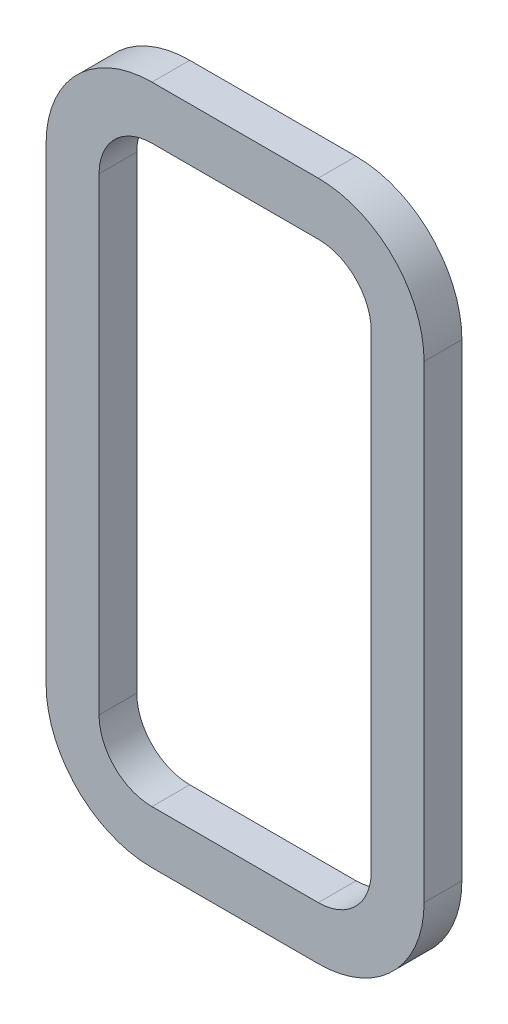
ISO-10303-21;
HEADER;
FILE_DESCRIPTION(('STEP AP214'),'2;1');
FILE_NAME('part.step','',(''),(''),'','','');
FILE_SCHEMA(('AUTOMOTIVE_DESIGN { 1 0 10303 214 1 1 1 1 }'));
ENDSEC;
DATA;
#1=APPLICATION_CONTEXT('core data for automotive mechanical design processes');
#2=APPLICATION_PROTOCOL_DEFINITION('international standard','automotive_design',2000,#1);
#3=PRODUCT_CONTEXT('',#1,'mechanical');
#4=PRODUCT('Part','Part','',(#3));
#5=PRODUCT_RELATED_PRODUCT_CATEGORY('part','',(#4));
#6=PRODUCT_DEFINITION_FORMATION('','',#4);
#7=PRODUCT_DEFINITION_CONTEXT('part definition',#1,'design');
#8=PRODUCT_DEFINITION('design','',#6,#7);
#9=PRODUCT_DEFINITION_SHAPE('','',#8);
#10=(LENGTH_UNIT() NAMED_UNIT(*) SI_UNIT(.MILLI.,.METRE.));
#11=(NAMED_UNIT(*) PLANE_ANGLE_UNIT() SI_UNIT($,.RADIAN.));
#12=(NAMED_UNIT(*) SI_UNIT($,.STERADIAN.) SOLID_ANGLE_UNIT());
#13=UNCERTAINTY_MEASURE_WITH_UNIT(LENGTH_MEASURE(1.E-05),#10,'distance_accuracy_value','');
#14=(GEOMETRIC_REPRESENTATION_CONTEXT(3) GLOBAL_UNCERTAINTY_ASSIGNED_CONTEXT((#13)) GLOBAL_UNIT_ASSIGNED_CONTEXT((#10,
#11,#12)) REPRESENTATION_CONTEXT('',''));
#15=CARTESIAN_POINT('',(0.,0.,0.));
#16=DIRECTION('',(0.,0.,1.));
#17=DIRECTION('',(1.,0.,0.));
#18=AXIS2_PLACEMENT_3D('',#15,#16,#17);
#19=CARTESIAN_POINT('',(-50.,-90.,10.));
#20=DIRECTION('',(0.,0.,1.));
#21=DIRECTION('',(1.,0.,0.));
#22=AXIS2_PLACEMENT_3D('',#19,#20,#21);
#23=PLANE('',#22);
#24=DIRECTION('',(0.,-1.,0.));
#25=VECTOR('',#24,1.);
#26=CARTESIAN_POINT('',(-50.,90.,10.));
#27=LINE('',#26,#25);
#28=CARTESIAN_POINT('',(-50.,62.,10.));
#29=VERTEX_POINT('',#28);
#30=CARTESIAN_POINT('',(-50.,-61.9999999999999,10.));
#31=VERTEX_POINT('',#30);
#32=EDGE_CURVE('E247',#29,#31,#27,.T.);
#33=ORIENTED_EDGE('',*,*,#32,.T.);
#34=CARTESIAN_POINT('',(-22.,-62.,10.));
#35=DIRECTION('',(0.,0.,1.));
#36=DIRECTION('',(1.,0.,0.));
#37=AXIS2_PLACEMENT_3D('',#34,#35,#36);
#38=CIRCLE('',#37,28.);
#39=CARTESIAN_POINT('',(-22.,-90.,10.));
#40=VERTEX_POINT('',#39);
#41=EDGE_CURVE('E231',#31,#40,#38,.T.);
#42=ORIENTED_EDGE('',*,*,#41,.T.);
#43=DIRECTION('',(1.,0.,0.));
#44=VECTOR('',#43,1.);
#45=CARTESIAN_POINT('',(-50.,-90.,10.));
#46=LINE('',#45,#44);
#47=CARTESIAN_POINT('',(22.,-90.,10.));
#48=VERTEX_POINT('',#47);
#49=EDGE_CURVE('E250',#40,#48,#46,.T.);
#50=ORIENTED_EDGE('',*,*,#49,.T.);
#51=CARTESIAN_POINT('',(22.,-62.,10.));
#52=DIRECTION('',(0.,0.,1.));
#53=DIRECTION('',(1.,0.,0.));
#54=AXIS2_PLACEMENT_3D('',#51,#52,#53);
#55=CIRCLE('',#54,28.);
#56=CARTESIAN_POINT('',(50.,-61.9999999999999,10.));
#57=VERTEX_POINT('',#56);
#58=EDGE_CURVE('E229',#48,#57,#55,.T.);
#59=ORIENTED_EDGE('',*,*,#58,.T.);
#60=DIRECTION('',(0.,1.,0.));
#61=VECTOR('',#60,1.);
#62=CARTESIAN_POINT('',(50.,90.,10.));
#63=LINE('',#62,#61);
#64=CARTESIAN_POINT('',(50.,62.,10.));
#65=VERTEX_POINT('',#64);
#66=EDGE_CURVE('E177',#57,#65,#63,.T.);
#67=ORIENTED_EDGE('',*,*,#66,.T.);
#68=CARTESIAN_POINT('',(22.,62.,10.));
#69=DIRECTION('',(0.,0.,1.));
#70=DIRECTION('',(1.,0.,0.));
#71=AXIS2_PLACEMENT_3D('',#68,#69,#70);
#72=CIRCLE('',#71,28.);
#73=CARTESIAN_POINT('',(22.,90.,10.));
#74=VERTEX_POINT('',#73);
#75=EDGE_CURVE('E55',#65,#74,#72,.T.);
#76=ORIENTED_EDGE('',*,*,#75,.T.);
#77=DIRECTION('',(-1.,0.,0.));
#78=VECTOR('',#77,1.);
#79=CARTESIAN_POINT('',(-50.,90.,10.));
#80=LINE('',#79,#78);
#81=CARTESIAN_POINT('',(-22.,90.,10.));
#82=VERTEX_POINT('',#81);
#83=EDGE_CURVE('E173',#74,#82,#80,.T.);
#84=ORIENTED_EDGE('',*,*,#83,.T.);
#85=CARTESIAN_POINT('',(-22.,62.,10.));
#86=DIRECTION('',(0.,0.,1.));
#87=DIRECTION('',(1.,0.,0.));
#88=AXIS2_PLACEMENT_3D('',#85,#86,#87);
#89=CIRCLE('',#88,28.);
#90=EDGE_CURVE('E227',#82,#29,#89,.T.);
#91=ORIENTED_EDGE('',*,*,#90,.T.);
#92=EDGE_LOOP('',(#33,#42,#50,#59,#67,#76,#84,#91));
#93=FACE_BOUND('',#92,.T.);
#94=DIRECTION('',(1.,0.,0.));
#95=VECTOR('',#94,1.);
#96=CARTESIAN_POINT('',(-36.,-76.,10.));
#97=LINE('',#96,#95);
#98=CARTESIAN_POINT('',(-22.,-76.,10.));
#99=VERTEX_POINT('',#98);
#100=CARTESIAN_POINT('',(22.,-76.,10.));
#101=VERTEX_POINT('',#100);
#102=EDGE_CURVE('E277',#99,#101,#97,.T.);
#103=ORIENTED_EDGE('',*,*,#102,.F.);
#104=CARTESIAN_POINT('',(-22.,-62.,10.));
#105=DIRECTION('',(0.,0.,1.));
#106=DIRECTION('',(1.,0.,0.));
#107=AXIS2_PLACEMENT_3D('',#104,#105,#106);
#108=CIRCLE('',#107,14.);
#109=CARTESIAN_POINT('',(-36.,-62.,10.));
#110=VERTEX_POINT('',#109);
#111=EDGE_CURVE('E159',#99,#110,#108,.F.);
#112=ORIENTED_EDGE('',*,*,#111,.T.);
#113=DIRECTION('',(0.,-1.,0.));
#114=VECTOR('',#113,1.);
#115=CARTESIAN_POINT('',(-36.,76.,10.));
#116=LINE('',#115,#114);
#117=CARTESIAN_POINT('',(-36.,62.,10.));
#118=VERTEX_POINT('',#117);
#119=EDGE_CURVE('E266',#118,#110,#116,.T.);
#120=ORIENTED_EDGE('',*,*,#119,.F.);
#121=CARTESIAN_POINT('',(-22.,62.,10.));
#122=DIRECTION('',(0.,0.,1.));
#123=DIRECTION('',(1.,0.,0.));
#124=AXIS2_PLACEMENT_3D('',#121,#122,#123);
#125=CIRCLE('',#124,14.);
#126=CARTESIAN_POINT('',(-22.,76.,10.));
#127=VERTEX_POINT('',#126);
#128=EDGE_CURVE('E158',#118,#127,#125,.F.);
#129=ORIENTED_EDGE('',*,*,#128,.T.);
#130=DIRECTION('',(-1.,0.,0.));
#131=VECTOR('',#130,1.);
#132=CARTESIAN_POINT('',(-36.,76.,10.));
#133=LINE('',#132,#131);
#134=CARTESIAN_POINT('',(22.,76.,10.));
#135=VERTEX_POINT('',#134);
#136=EDGE_CURVE('E260',#135,#127,#133,.T.);
#137=ORIENTED_EDGE('',*,*,#136,.F.);
#138=CARTESIAN_POINT('',(22.,62.,10.));
#139=DIRECTION('',(0.,0.,1.));
#140=DIRECTION('',(1.,0.,0.));
#141=AXIS2_PLACEMENT_3D('',#138,#139,#140);
#142=CIRCLE('',#141,14.);
#143=CARTESIAN_POINT('',(36.,62.,10.));
#144=VERTEX_POINT('',#143);
#145=EDGE_CURVE('E202',#135,#144,#142,.F.);
#146=ORIENTED_EDGE('',*,*,#145,.T.);
#147=DIRECTION('',(0.,1.,0.));
#148=VECTOR('',#147,1.);
#149=CARTESIAN_POINT('',(36.,76.,10.));
#150=LINE('',#149,#148);
#151=CARTESIAN_POINT('',(36.,-62.,10.));
#152=VERTEX_POINT('',#151);
#153=EDGE_CURVE('E274',#152,#144,#150,.T.);
#154=ORIENTED_EDGE('',*,*,#153,.F.);
#155=CARTESIAN_POINT('',(22.,-62.,10.));
#156=DIRECTION('',(0.,0.,1.));
#157=DIRECTION('',(1.,0.,0.));
#158=AXIS2_PLACEMENT_3D('',#155,#156,#157);
#159=CIRCLE('',#158,14.);
#160=EDGE_CURVE('E206',#152,#101,#159,.F.);
#161=ORIENTED_EDGE('',*,*,#160,.T.);
#162=EDGE_LOOP('',(#103,#112,#120,#129,#137,#146,#154,#161));
#163=FACE_BOUND('',#162,.T.);
#164=ADVANCED_FACE('F35',(#93,#163),#23,.T.);
#165=CARTESIAN_POINT('',(-50.,-90.,0.));
#166=DIRECTION('',(0.,0.,1.));
#167=DIRECTION('',(1.,0.,0.));
#168=AXIS2_PLACEMENT_3D('',#165,#166,#167);
#169=PLANE('',#168);
#170=DIRECTION('',(1.,0.,0.));
#171=VECTOR('',#170,1.);
#172=CARTESIAN_POINT('',(-50.,-90.,0.));
#173=LINE('',#172,#171);
#174=CARTESIAN_POINT('',(-22.,-90.,0.));
#175=VERTEX_POINT('',#174);
#176=CARTESIAN_POINT('',(22.,-90.,0.));
#177=VERTEX_POINT('',#176);
#178=EDGE_CURVE('E252',#175,#177,#173,.T.);
#179=ORIENTED_EDGE('',*,*,#178,.F.);
#180=CARTESIAN_POINT('',(-22.,-62.,0.));
#181=DIRECTION('',(0.,0.,1.));
#182=DIRECTION('',(1.,0.,0.));
#183=AXIS2_PLACEMENT_3D('',#180,#181,#182);
#184=CIRCLE('',#183,28.);
#185=CARTESIAN_POINT('',(-50.,-61.9999999999999,0.));
#186=VERTEX_POINT('',#185);
#187=EDGE_CURVE('E219',#175,#186,#184,.F.);
#188=ORIENTED_EDGE('',*,*,#187,.T.);
#189=DIRECTION('',(0.,-1.,0.));
#190=VECTOR('',#189,1.);
#191=CARTESIAN_POINT('',(-50.,90.,0.));
#192=LINE('',#191,#190);
#193=CARTESIAN_POINT('',(-50.,62.,0.));
#194=VERTEX_POINT('',#193);
#195=EDGE_CURVE('E256',#194,#186,#192,.T.);
#196=ORIENTED_EDGE('',*,*,#195,.F.);
#197=CARTESIAN_POINT('',(-22.,62.,0.));
#198=DIRECTION('',(0.,0.,1.));
#199=DIRECTION('',(1.,0.,0.));
#200=AXIS2_PLACEMENT_3D('',#197,#198,#199);
#201=CIRCLE('',#200,28.);
#202=CARTESIAN_POINT('',(-22.,90.,0.));
#203=VERTEX_POINT('',#202);
#204=EDGE_CURVE('E215',#194,#203,#201,.F.);
#205=ORIENTED_EDGE('',*,*,#204,.T.);
#206=DIRECTION('',(-1.,0.,0.));
#207=VECTOR('',#206,1.);
#208=CARTESIAN_POINT('',(-50.,90.,0.));
#209=LINE('',#208,#207);
#210=CARTESIAN_POINT('',(22.,90.,0.));
#211=VERTEX_POINT('',#210);
#212=EDGE_CURVE('E180',#211,#203,#209,.T.);
#213=ORIENTED_EDGE('',*,*,#212,.F.);
#214=CARTESIAN_POINT('',(22.,62.,0.));
#215=DIRECTION('',(0.,0.,1.));
#216=DIRECTION('',(1.,0.,0.));
#217=AXIS2_PLACEMENT_3D('',#214,#215,#216);
#218=CIRCLE('',#217,28.);
#219=CARTESIAN_POINT('',(50.,62.,0.));
#220=VERTEX_POINT('',#219);
#221=EDGE_CURVE('E213',#211,#220,#218,.F.);
#222=ORIENTED_EDGE('',*,*,#221,.T.);
#223=DIRECTION('',(0.,1.,0.));
#224=VECTOR('',#223,1.);
#225=CARTESIAN_POINT('',(50.,90.,0.));
#226=LINE('',#225,#224);
#227=CARTESIAN_POINT('',(50.,-61.9999999999999,0.));
#228=VERTEX_POINT('',#227);
#229=EDGE_CURVE('E248',#228,#220,#226,.T.);
#230=ORIENTED_EDGE('',*,*,#229,.F.);
#231=CARTESIAN_POINT('',(22.,-62.,0.));
#232=DIRECTION('',(0.,0.,1.));
#233=DIRECTION('',(1.,0.,0.));
#234=AXIS2_PLACEMENT_3D('',#231,#232,#233);
#235=CIRCLE('',#234,28.);
#236=EDGE_CURVE('E217',#228,#177,#235,.F.);
#237=ORIENTED_EDGE('',*,*,#236,.T.);
#238=EDGE_LOOP('',(#179,#188,#196,#205,#213,#222,#230,#237));
#239=FACE_BOUND('',#238,.T.);
#240=DIRECTION('',(-1.,0.,0.));
#241=VECTOR('',#240,1.);
#242=CARTESIAN_POINT('',(-36.,76.,0.));
#243=LINE('',#242,#241);
#244=CARTESIAN_POINT('',(22.,76.,0.));
#245=VERTEX_POINT('',#244);
#246=CARTESIAN_POINT('',(-22.,76.,0.));
#247=VERTEX_POINT('',#246);
#248=EDGE_CURVE('E153',#245,#247,#243,.T.);
#249=ORIENTED_EDGE('',*,*,#248,.T.);
#250=CARTESIAN_POINT('',(-22.,62.,0.));
#251=DIRECTION('',(0.,0.,1.));
#252=DIRECTION('',(1.,0.,0.));
#253=AXIS2_PLACEMENT_3D('',#250,#251,#252);
#254=CIRCLE('',#253,14.);
#255=CARTESIAN_POINT('',(-36.,62.,0.));
#256=VERTEX_POINT('',#255);
#257=EDGE_CURVE('E148',#247,#256,#254,.T.);
#258=ORIENTED_EDGE('',*,*,#257,.T.);
#259=DIRECTION('',(0.,-1.,0.));
#260=VECTOR('',#259,1.);
#261=CARTESIAN_POINT('',(-36.,76.,0.));
#262=LINE('',#261,#260);
#263=CARTESIAN_POINT('',(-36.,-62.,0.));
#264=VERTEX_POINT('',#263);
#265=EDGE_CURVE('E151',#256,#264,#262,.T.);
#266=ORIENTED_EDGE('',*,*,#265,.T.);
#267=CARTESIAN_POINT('',(-22.,-62.,0.));
#268=DIRECTION('',(0.,0.,1.));
#269=DIRECTION('',(1.,0.,0.));
#270=AXIS2_PLACEMENT_3D('',#267,#268,#269);
#271=CIRCLE('',#270,14.);
#272=CARTESIAN_POINT('',(-22.,-76.,0.));
#273=VERTEX_POINT('',#272);
#274=EDGE_CURVE('E196',#264,#273,#271,.T.);
#275=ORIENTED_EDGE('',*,*,#274,.T.);
#276=DIRECTION('',(1.,0.,0.));
#277=VECTOR('',#276,1.);
#278=CARTESIAN_POINT('',(-36.,-76.,0.));
#279=LINE('',#278,#277);
#280=CARTESIAN_POINT('',(22.,-76.,0.));
#281=VERTEX_POINT('',#280);
#282=EDGE_CURVE('E169',#273,#281,#279,.T.);
#283=ORIENTED_EDGE('',*,*,#282,.T.);
#284=CARTESIAN_POINT('',(22.,-62.,0.));
#285=DIRECTION('',(0.,0.,1.));
#286=DIRECTION('',(1.,0.,0.));
#287=AXIS2_PLACEMENT_3D('',#284,#285,#286);
#288=CIRCLE('',#287,14.);
#289=CARTESIAN_POINT('',(36.,-62.,0.));
#290=VERTEX_POINT('',#289);
#291=EDGE_CURVE('E204',#281,#290,#288,.T.);
#292=ORIENTED_EDGE('',*,*,#291,.T.);
#293=DIRECTION('',(0.,1.,0.));
#294=VECTOR('',#293,1.);
#295=CARTESIAN_POINT('',(36.,76.,0.));
#296=LINE('',#295,#294);
#297=CARTESIAN_POINT('',(36.,62.,0.));
#298=VERTEX_POINT('',#297);
#299=EDGE_CURVE('E267',#290,#298,#296,.T.);
#300=ORIENTED_EDGE('',*,*,#299,.T.);
#301=CARTESIAN_POINT('',(22.,62.,0.));
#302=DIRECTION('',(0.,0.,1.));
#303=DIRECTION('',(1.,0.,0.));
#304=AXIS2_PLACEMENT_3D('',#301,#302,#303);
#305=CIRCLE('',#304,14.);
#306=EDGE_CURVE('E200',#298,#245,#305,.T.);
#307=ORIENTED_EDGE('',*,*,#306,.T.);
#308=EDGE_LOOP('',(#249,#258,#266,#275,#283,#292,#300,#307));
#309=FACE_BOUND('',#308,.T.);
#310=ADVANCED_FACE('F150',(#239,#309),#169,.F.);
#311=CARTESIAN_POINT('',(-50.,90.,10.));
#312=DIRECTION('',(1.,0.,0.));
#313=DIRECTION('',(0.,1.,0.));
#314=AXIS2_PLACEMENT_3D('',#311,#312,#313);
#315=PLANE('',#314);
#316=ORIENTED_EDGE('',*,*,#195,.T.);
#317=DIRECTION('',(0.,0.,-1.));
#318=VECTOR('',#317,1.);
#319=CARTESIAN_POINT('',(-50.,-62.,10.));
#320=LINE('',#319,#318);
#321=EDGE_CURVE('E224',#186,#31,#320,.F.);
#322=ORIENTED_EDGE('',*,*,#321,.T.);
#323=ORIENTED_EDGE('',*,*,#32,.F.);
#324=DIRECTION('',(0.,0.,-1.));
#325=VECTOR('',#324,1.);
#326=CARTESIAN_POINT('',(-50.,62.,10.));
#327=LINE('',#326,#325);
#328=EDGE_CURVE('E221',#29,#194,#327,.T.);
#329=ORIENTED_EDGE('',*,*,#328,.T.);
#330=EDGE_LOOP('',(#316,#322,#323,#329));
#331=FACE_BOUND('',#330,.T.);
#332=ADVANCED_FACE('F311',(#331),#315,.F.);
#333=CARTESIAN_POINT('',(-50.,-90.,10.));
#334=DIRECTION('',(0.,1.,0.));
#335=DIRECTION('',(0.,0.,1.));
#336=AXIS2_PLACEMENT_3D('',#333,#334,#335);
#337=PLANE('',#336);
#338=ORIENTED_EDGE('',*,*,#49,.F.);
#339=DIRECTION('',(0.,0.,-1.));
#340=VECTOR('',#339,1.);
#341=CARTESIAN_POINT('',(-22.,-90.,10.));
#342=LINE('',#341,#340);
#343=EDGE_CURVE('E210',#40,#175,#342,.T.);
#344=ORIENTED_EDGE('',*,*,#343,.T.);
#345=ORIENTED_EDGE('',*,*,#178,.T.);
#346=DIRECTION('',(0.,0.,-1.));
#347=VECTOR('',#346,1.);
#348=CARTESIAN_POINT('',(22.,-90.,10.));
#349=LINE('',#348,#347);
#350=EDGE_CURVE('E208',#177,#48,#349,.F.);
#351=ORIENTED_EDGE('',*,*,#350,.T.);
#352=EDGE_LOOP('',(#338,#344,#345,#351));
#353=FACE_BOUND('',#352,.T.);
#354=ADVANCED_FACE('F321',(#353),#337,.F.);
#355=CARTESIAN_POINT('',(50.,90.,10.));
#356=DIRECTION('',(-1.,0.,0.));
#357=DIRECTION('',(0.,0.,1.));
#358=AXIS2_PLACEMENT_3D('',#355,#356,#357);
#359=PLANE('',#358);
#360=ORIENTED_EDGE('',*,*,#66,.F.);
#361=DIRECTION('',(0.,0.,-1.));
#362=VECTOR('',#361,1.);
#363=CARTESIAN_POINT('',(50.,-62.,10.));
#364=LINE('',#363,#362);
#365=EDGE_CURVE('E235',#57,#228,#364,.T.);
#366=ORIENTED_EDGE('',*,*,#365,.T.);
#367=ORIENTED_EDGE('',*,*,#229,.T.);
#368=DIRECTION('',(0.,0.,-1.));
#369=VECTOR('',#368,1.);
#370=CARTESIAN_POINT('',(50.,62.,10.));
#371=LINE('',#370,#369);
#372=EDGE_CURVE('E233',#220,#65,#371,.F.);
#373=ORIENTED_EDGE('',*,*,#372,.T.);
#374=EDGE_LOOP('',(#360,#366,#367,#373));
#375=FACE_BOUND('',#374,.T.);
#376=ADVANCED_FACE('F318',(#375),#359,.F.);
#377=CARTESIAN_POINT('',(-50.,90.,10.));
#378=DIRECTION('',(0.,-1.,0.));
#379=DIRECTION('',(0.,0.,-1.));
#380=AXIS2_PLACEMENT_3D('',#377,#378,#379);
#381=PLANE('',#380);
#382=ORIENTED_EDGE('',*,*,#212,.T.);
#383=DIRECTION('',(0.,0.,-1.));
#384=VECTOR('',#383,1.);
#385=CARTESIAN_POINT('',(-22.,90.,10.));
#386=LINE('',#385,#384);
#387=EDGE_CURVE('E11',#203,#82,#386,.F.);
#388=ORIENTED_EDGE('',*,*,#387,.T.);
#389=ORIENTED_EDGE('',*,*,#83,.F.);
#390=DIRECTION('',(0.,0.,-1.));
#391=VECTOR('',#390,1.);
#392=CARTESIAN_POINT('',(22.,90.,10.));
#393=LINE('',#392,#391);
#394=EDGE_CURVE('E43',#74,#211,#393,.T.);
#395=ORIENTED_EDGE('',*,*,#394,.T.);
#396=EDGE_LOOP('',(#382,#388,#389,#395));
#397=FACE_BOUND('',#396,.T.);
#398=ADVANCED_FACE('F240',(#397),#381,.F.);
#399=CARTESIAN_POINT('',(-36.,76.,10.));
#400=DIRECTION('',(1.,0.,0.));
#401=DIRECTION('',(0.,0.,-1.));
#402=AXIS2_PLACEMENT_3D('',#399,#400,#401);
#403=PLANE('',#402);
#404=ORIENTED_EDGE('',*,*,#119,.T.);
#405=DIRECTION('',(0.,0.,-1.));
#406=VECTOR('',#405,1.);
#407=CARTESIAN_POINT('',(-36.,-62.,0.));
#408=LINE('',#407,#406);
#409=EDGE_CURVE('E168',#110,#264,#408,.T.);
#410=ORIENTED_EDGE('',*,*,#409,.T.);
#411=ORIENTED_EDGE('',*,*,#265,.F.);
#412=DIRECTION('',(0.,0.,-1.));
#413=VECTOR('',#412,1.);
#414=CARTESIAN_POINT('',(-36.,62.,10.));
#415=LINE('',#414,#413);
#416=EDGE_CURVE('E165',#256,#118,#415,.F.);
#417=ORIENTED_EDGE('',*,*,#416,.T.);
#418=EDGE_LOOP('',(#404,#410,#411,#417));
#419=FACE_BOUND('',#418,.T.);
#420=ADVANCED_FACE('F164',(#419),#403,.T.);
#421=CARTESIAN_POINT('',(-36.,-76.,10.));
#422=DIRECTION('',(0.,1.,0.));
#423=DIRECTION('',(0.,0.,1.));
#424=AXIS2_PLACEMENT_3D('',#421,#422,#423);
#425=PLANE('',#424);
#426=ORIENTED_EDGE('',*,*,#282,.F.);
#427=DIRECTION('',(0.,0.,-1.));
#428=VECTOR('',#427,1.);
#429=CARTESIAN_POINT('',(-22.,-76.,10.));
#430=LINE('',#429,#428);
#431=EDGE_CURVE('E185',#273,#99,#430,.F.);
#432=ORIENTED_EDGE('',*,*,#431,.T.);
#433=ORIENTED_EDGE('',*,*,#102,.T.);
#434=DIRECTION('',(0.,0.,-1.));
#435=VECTOR('',#434,1.);
#436=CARTESIAN_POINT('',(22.,-76.,0.));
#437=LINE('',#436,#435);
#438=EDGE_CURVE('E175',#101,#281,#437,.T.);
#439=ORIENTED_EDGE('',*,*,#438,.T.);
#440=EDGE_LOOP('',(#426,#432,#433,#439));
#441=FACE_BOUND('',#440,.T.);
#442=ADVANCED_FACE('F287',(#441),#425,.T.);
#443=CARTESIAN_POINT('',(36.,76.,10.));
#444=DIRECTION('',(-1.,0.,0.));
#445=DIRECTION('',(0.,0.,1.));
#446=AXIS2_PLACEMENT_3D('',#443,#444,#445);
#447=PLANE('',#446);
#448=ORIENTED_EDGE('',*,*,#153,.T.);
#449=DIRECTION('',(0.,0.,-1.));
#450=VECTOR('',#449,1.);
#451=CARTESIAN_POINT('',(36.,62.,0.));
#452=LINE('',#451,#450);
#453=EDGE_CURVE('E193',#144,#298,#452,.T.);
#454=ORIENTED_EDGE('',*,*,#453,.T.);
#455=ORIENTED_EDGE('',*,*,#299,.F.);
#456=DIRECTION('',(0.,0.,-1.));
#457=VECTOR('',#456,1.);
#458=CARTESIAN_POINT('',(36.,-62.,10.));
#459=LINE('',#458,#457);
#460=EDGE_CURVE('E191',#290,#152,#459,.F.);
#461=ORIENTED_EDGE('',*,*,#460,.T.);
#462=EDGE_LOOP('',(#448,#454,#455,#461));
#463=FACE_BOUND('',#462,.T.);
#464=ADVANCED_FACE('F296',(#463),#447,.T.);
#465=CARTESIAN_POINT('',(-36.,76.,10.));
#466=DIRECTION('',(0.,-1.,0.));
#467=DIRECTION('',(0.,0.,-1.));
#468=AXIS2_PLACEMENT_3D('',#465,#466,#467);
#469=PLANE('',#468);
#470=ORIENTED_EDGE('',*,*,#136,.T.);
#471=DIRECTION('',(0.,0.,-1.));
#472=VECTOR('',#471,1.);
#473=CARTESIAN_POINT('',(-22.,76.,0.));
#474=LINE('',#473,#472);
#475=EDGE_CURVE('E189',#127,#247,#474,.T.);
#476=ORIENTED_EDGE('',*,*,#475,.T.);
#477=ORIENTED_EDGE('',*,*,#248,.F.);
#478=DIRECTION('',(0.,0.,-1.));
#479=VECTOR('',#478,1.);
#480=CARTESIAN_POINT('',(22.,76.,10.));
#481=LINE('',#480,#479);
#482=EDGE_CURVE('E187',#245,#135,#481,.F.);
#483=ORIENTED_EDGE('',*,*,#482,.T.);
#484=EDGE_LOOP('',(#470,#476,#477,#483));
#485=FACE_BOUND('',#484,.T.);
#486=ADVANCED_FACE('F304',(#485),#469,.T.);
#487=CARTESIAN_POINT('',(-22.,-62.,10.));
#488=DIRECTION('',(0.,0.,1.));
#489=DIRECTION('',(1.,0.,0.));
#490=AXIS2_PLACEMENT_3D('',#487,#488,#489);
#491=CYLINDRICAL_SURFACE('',#490,14.);
#492=ORIENTED_EDGE('',*,*,#111,.F.);
#493=ORIENTED_EDGE('',*,*,#431,.F.);
#494=ORIENTED_EDGE('',*,*,#274,.F.);
#495=ORIENTED_EDGE('',*,*,#409,.F.);
#496=EDGE_LOOP('',(#492,#493,#494,#495));
#497=FACE_BOUND('',#496,.T.);
#498=ADVANCED_FACE('F283',(#497),#491,.F.);
#499=CARTESIAN_POINT('',(-22.,62.,10.));
#500=DIRECTION('',(0.,0.,1.));
#501=DIRECTION('',(1.,0.,0.));
#502=AXIS2_PLACEMENT_3D('',#499,#500,#501);
#503=CYLINDRICAL_SURFACE('',#502,14.);
#504=ORIENTED_EDGE('',*,*,#128,.F.);
#505=ORIENTED_EDGE('',*,*,#416,.F.);
#506=ORIENTED_EDGE('',*,*,#257,.F.);
#507=ORIENTED_EDGE('',*,*,#475,.F.);
#508=EDGE_LOOP('',(#504,#505,#506,#507));
#509=FACE_BOUND('',#508,.T.);
#510=ADVANCED_FACE('F172',(#509),#503,.F.);
#511=CARTESIAN_POINT('',(22.,62.,10.));
#512=DIRECTION('',(0.,0.,1.));
#513=DIRECTION('',(1.,0.,0.));
#514=AXIS2_PLACEMENT_3D('',#511,#512,#513);
#515=CYLINDRICAL_SURFACE('',#514,14.);
#516=ORIENTED_EDGE('',*,*,#145,.F.);
#517=ORIENTED_EDGE('',*,*,#482,.F.);
#518=ORIENTED_EDGE('',*,*,#306,.F.);
#519=ORIENTED_EDGE('',*,*,#453,.F.);
#520=EDGE_LOOP('',(#516,#517,#518,#519));
#521=FACE_BOUND('',#520,.T.);
#522=ADVANCED_FACE('F301',(#521),#515,.F.);
#523=CARTESIAN_POINT('',(22.,-62.,10.));
#524=DIRECTION('',(0.,0.,1.));
#525=DIRECTION('',(1.,0.,0.));
#526=AXIS2_PLACEMENT_3D('',#523,#524,#525);
#527=CYLINDRICAL_SURFACE('',#526,14.);
#528=ORIENTED_EDGE('',*,*,#160,.F.);
#529=ORIENTED_EDGE('',*,*,#460,.F.);
#530=ORIENTED_EDGE('',*,*,#291,.F.);
#531=ORIENTED_EDGE('',*,*,#438,.F.);
#532=EDGE_LOOP('',(#528,#529,#530,#531));
#533=FACE_BOUND('',#532,.T.);
#534=ADVANCED_FACE('F292',(#533),#527,.F.);
#535=CARTESIAN_POINT('',(-22.,-62.,10.));
#536=DIRECTION('',(0.,0.,-1.));
#537=DIRECTION('',(-1.,0.,0.));
#538=AXIS2_PLACEMENT_3D('',#535,#536,#537);
#539=CYLINDRICAL_SURFACE('',#538,28.);
#540=ORIENTED_EDGE('',*,*,#41,.F.);
#541=ORIENTED_EDGE('',*,*,#321,.F.);
#542=ORIENTED_EDGE('',*,*,#187,.F.);
#543=ORIENTED_EDGE('',*,*,#343,.F.);
#544=EDGE_LOOP('',(#540,#541,#542,#543));
#545=FACE_BOUND('',#544,.T.);
#546=ADVANCED_FACE('F336',(#545),#539,.T.);
#547=CARTESIAN_POINT('',(22.,-62.,10.));
#548=DIRECTION('',(0.,0.,-1.));
#549=DIRECTION('',(-1.,0.,0.));
#550=AXIS2_PLACEMENT_3D('',#547,#548,#549);
#551=CYLINDRICAL_SURFACE('',#550,28.);
#552=ORIENTED_EDGE('',*,*,#58,.F.);
#553=ORIENTED_EDGE('',*,*,#350,.F.);
#554=ORIENTED_EDGE('',*,*,#236,.F.);
#555=ORIENTED_EDGE('',*,*,#365,.F.);
#556=EDGE_LOOP('',(#552,#553,#554,#555));
#557=FACE_BOUND('',#556,.T.);
#558=ADVANCED_FACE('F339',(#557),#551,.T.);
#559=CARTESIAN_POINT('',(-22.,62.,10.));
#560=DIRECTION('',(0.,0.,-1.));
#561=DIRECTION('',(-1.,0.,0.));
#562=AXIS2_PLACEMENT_3D('',#559,#560,#561);
#563=CYLINDRICAL_SURFACE('',#562,28.);
#564=ORIENTED_EDGE('',*,*,#90,.F.);
#565=ORIENTED_EDGE('',*,*,#387,.F.);
#566=ORIENTED_EDGE('',*,*,#204,.F.);
#567=ORIENTED_EDGE('',*,*,#328,.F.);
#568=EDGE_LOOP('',(#564,#565,#566,#567));
#569=FACE_BOUND('',#568,.T.);
#570=ADVANCED_FACE('F342',(#569),#563,.T.);
#571=CARTESIAN_POINT('',(22.,62.,10.));
#572=DIRECTION('',(0.,0.,-1.));
#573=DIRECTION('',(-1.,0.,0.));
#574=AXIS2_PLACEMENT_3D('',#571,#572,#573);
#575=CYLINDRICAL_SURFACE('',#574,28.);
#576=ORIENTED_EDGE('',*,*,#75,.F.);
#577=ORIENTED_EDGE('',*,*,#372,.F.);
#578=ORIENTED_EDGE('',*,*,#221,.F.);
#579=ORIENTED_EDGE('',*,*,#394,.F.);
#580=EDGE_LOOP('',(#576,#577,#578,#579));
#581=FACE_BOUND('',#580,.T.);
#582=ADVANCED_FACE('F37',(#581),#575,.T.);
#583=CLOSED_SHELL('',(#164,#310,#332,#354,#376,#398,#420,#442,#464,#486,#498,#510,#522,#534,
#546,#558,#570,#582));
#584=MANIFOLD_SOLID_BREP('B2',#583);
#585=ADVANCED_BREP_SHAPE_REPRESENTATION('',(#18,#584),#14);
#586=SHAPE_DEFINITION_REPRESENTATION(#9,#585);
ENDSEC;
END-ISO-10303-21;
